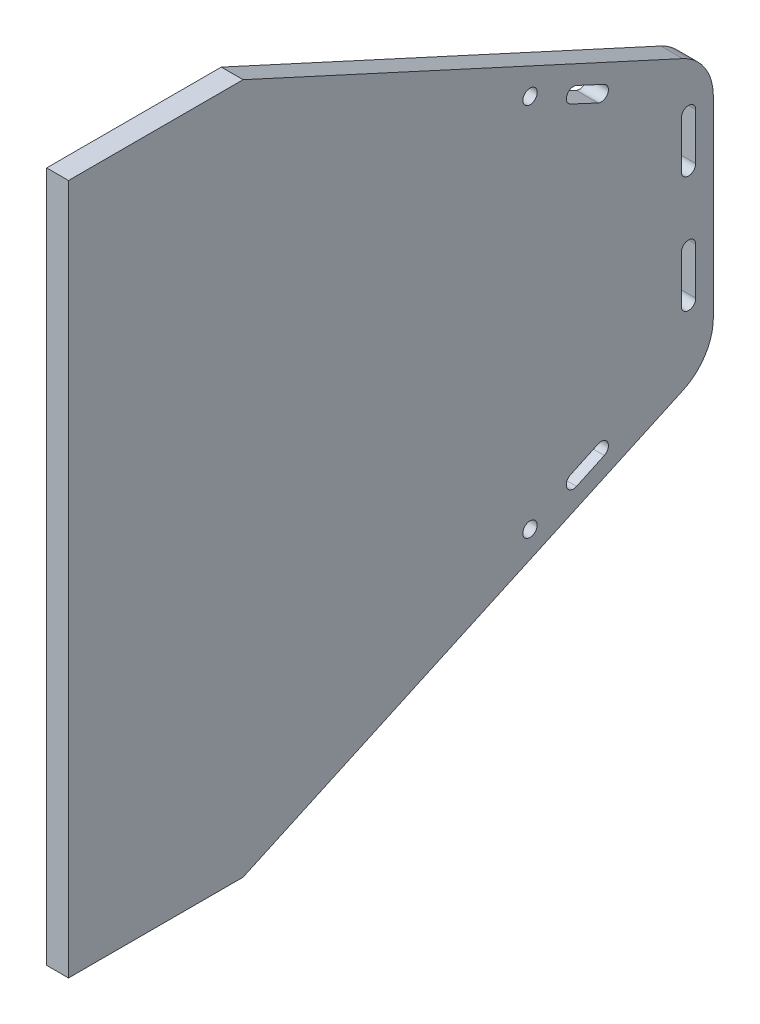
ISO-10303-21;
HEADER;
FILE_DESCRIPTION(('STEP AP214'),'2;1');
FILE_NAME('part.step','',(''),(''),'','','');
FILE_SCHEMA(('AUTOMOTIVE_DESIGN { 1 0 10303 214 1 1 1 1 }'));
ENDSEC;
DATA;
#1=APPLICATION_CONTEXT('core data for automotive mechanical design processes');
#2=APPLICATION_PROTOCOL_DEFINITION('international standard','automotive_design',2000,#1);
#3=PRODUCT_CONTEXT('',#1,'mechanical');
#4=PRODUCT('Part','Part','',(#3));
#5=PRODUCT_RELATED_PRODUCT_CATEGORY('part','',(#4));
#6=PRODUCT_DEFINITION_FORMATION('','',#4);
#7=PRODUCT_DEFINITION_CONTEXT('part definition',#1,'design');
#8=PRODUCT_DEFINITION('design','',#6,#7);
#9=PRODUCT_DEFINITION_SHAPE('','',#8);
#10=(LENGTH_UNIT() NAMED_UNIT(*) SI_UNIT(.MILLI.,.METRE.));
#11=(NAMED_UNIT(*) PLANE_ANGLE_UNIT() SI_UNIT($,.RADIAN.));
#12=(NAMED_UNIT(*) SI_UNIT($,.STERADIAN.) SOLID_ANGLE_UNIT());
#13=UNCERTAINTY_MEASURE_WITH_UNIT(LENGTH_MEASURE(1.E-05),#10,'distance_accuracy_value','');
#14=(GEOMETRIC_REPRESENTATION_CONTEXT(3) GLOBAL_UNCERTAINTY_ASSIGNED_CONTEXT((#13)) GLOBAL_UNIT_ASSIGNED_CONTEXT((#10,
#11,#12)) REPRESENTATION_CONTEXT('',''));
#15=CARTESIAN_POINT('',(0.,0.,0.));
#16=DIRECTION('',(0.,0.,1.));
#17=DIRECTION('',(1.,0.,0.));
#18=AXIS2_PLACEMENT_3D('',#15,#16,#17);
#19=CARTESIAN_POINT('',(5.,13.7554131280701,-91.6781823968794));
#20=DIRECTION('',(-1.,0.,0.));
#21=DIRECTION('',(0.,0.,1.));
#22=AXIS2_PLACEMENT_3D('',#19,#20,#21);
#23=CYLINDRICAL_SURFACE('',#22,12.);
#24=CARTESIAN_POINT('',(0.,13.7554131280701,-91.6781823968794));
#25=DIRECTION('',(1.,0.,0.));
#26=DIRECTION('',(0.,0.,-1.));
#27=AXIS2_PLACEMENT_3D('',#24,#25,#26);
#28=CIRCLE('',#27,12.);
#29=CARTESIAN_POINT('',(0.,2.84719137054536,-96.6792520913213));
#30=VERTEX_POINT('',#29);
#31=CARTESIAN_POINT('',(0.,13.7554131280701,-103.678182396879));
#32=VERTEX_POINT('',#31);
#33=EDGE_CURVE('E384',#30,#32,#28,.T.);
#34=ORIENTED_EDGE('',*,*,#33,.T.);
#35=DIRECTION('',(-1.,0.,0.));
#36=VECTOR('',#35,1.);
#37=CARTESIAN_POINT('',(5.,13.7554131280701,-103.678182396879));
#38=LINE('',#37,#36);
#39=CARTESIAN_POINT('',(5.,13.7554131280701,-103.678182396879));
#40=VERTEX_POINT('',#39);
#41=EDGE_CURVE('E11',#40,#32,#38,.T.);
#42=ORIENTED_EDGE('',*,*,#41,.F.);
#43=CARTESIAN_POINT('',(5.,13.7554131280701,-91.6781823968794));
#44=DIRECTION('',(1.,0.,0.));
#45=DIRECTION('',(0.,0.,-1.));
#46=AXIS2_PLACEMENT_3D('',#43,#44,#45);
#47=CIRCLE('',#46,12.);
#48=CARTESIAN_POINT('',(5.,2.84719137054536,-96.6792520913213));
#49=VERTEX_POINT('',#48);
#50=EDGE_CURVE('E394',#49,#40,#47,.T.);
#51=ORIENTED_EDGE('',*,*,#50,.F.);
#52=DIRECTION('',(-1.,0.,0.));
#53=VECTOR('',#52,1.);
#54=CARTESIAN_POINT('',(5.,2.84719137054536,-96.6792520913213));
#55=LINE('',#54,#53);
#56=EDGE_CURVE('E420',#49,#30,#55,.T.);
#57=ORIENTED_EDGE('',*,*,#56,.T.);
#58=EDGE_LOOP('',(#34,#42,#51,#57));
#59=FACE_BOUND('',#58,.T.);
#60=ADVANCED_FACE('F43',(#59),#23,.T.);
#61=CARTESIAN_POINT('',(5.,13.7554131280701,-103.678182396879));
#62=DIRECTION('',(0.,0.,1.));
#63=DIRECTION('',(1.,0.,0.));
#64=AXIS2_PLACEMENT_3D('',#61,#62,#63);
#65=PLANE('',#64);
#66=DIRECTION('',(0.,1.,0.));
#67=VECTOR('',#66,1.);
#68=CARTESIAN_POINT('',(0.,13.7554131280701,-103.678182396879));
#69=LINE('',#68,#67);
#70=CARTESIAN_POINT('',(0.,57.80541312807,-103.678182396879));
#71=VERTEX_POINT('',#70);
#72=EDGE_CURVE('E424',#32,#71,#69,.T.);
#73=ORIENTED_EDGE('',*,*,#72,.T.);
#74=DIRECTION('',(-1.,0.,0.));
#75=VECTOR('',#74,1.);
#76=CARTESIAN_POINT('',(5.,57.80541312807,-103.678182396879));
#77=LINE('',#76,#75);
#78=CARTESIAN_POINT('',(5.,57.80541312807,-103.678182396879));
#79=VERTEX_POINT('',#78);
#80=EDGE_CURVE('E51',#79,#71,#77,.T.);
#81=ORIENTED_EDGE('',*,*,#80,.F.);
#82=DIRECTION('',(0.,1.,0.));
#83=VECTOR('',#82,1.);
#84=CARTESIAN_POINT('',(5.,13.7554131280701,-103.678182396879));
#85=LINE('',#84,#83);
#86=EDGE_CURVE('E398',#40,#79,#85,.T.);
#87=ORIENTED_EDGE('',*,*,#86,.F.);
#88=ORIENTED_EDGE('',*,*,#41,.T.);
#89=EDGE_LOOP('',(#73,#81,#87,#88));
#90=FACE_BOUND('',#89,.T.);
#91=ADVANCED_FACE('F494',(#90),#65,.F.);
#92=CARTESIAN_POINT('',(5.,57.8054131280701,-91.6781823968794));
#93=DIRECTION('',(-1.,0.,0.));
#94=DIRECTION('',(0.,0.,1.));
#95=AXIS2_PLACEMENT_3D('',#92,#93,#94);
#96=CYLINDRICAL_SURFACE('',#95,12.);
#97=CARTESIAN_POINT('',(0.,57.8054131280701,-91.6781823968794));
#98=DIRECTION('',(1.,0.,0.));
#99=DIRECTION('',(0.,0.,-1.));
#100=AXIS2_PLACEMENT_3D('',#97,#98,#99);
#101=CIRCLE('',#100,12.);
#102=CARTESIAN_POINT('',(0.,68.7136348855948,-96.6792520913213));
#103=VERTEX_POINT('',#102);
#104=EDGE_CURVE('E427',#71,#103,#101,.T.);
#105=ORIENTED_EDGE('',*,*,#104,.T.);
#106=DIRECTION('',(-1.,0.,0.));
#107=VECTOR('',#106,1.);
#108=CARTESIAN_POINT('',(5.,68.7136348855948,-96.6792520913213));
#109=LINE('',#108,#107);
#110=CARTESIAN_POINT('',(5.,68.7136348855948,-96.6792520913213));
#111=VERTEX_POINT('',#110);
#112=EDGE_CURVE('E463',#111,#103,#109,.T.);
#113=ORIENTED_EDGE('',*,*,#112,.F.);
#114=CARTESIAN_POINT('',(5.,57.8054131280701,-91.6781823968794));
#115=DIRECTION('',(1.,0.,0.));
#116=DIRECTION('',(0.,0.,-1.));
#117=AXIS2_PLACEMENT_3D('',#114,#115,#116);
#118=CIRCLE('',#117,12.);
#119=EDGE_CURVE('E402',#79,#111,#118,.T.);
#120=ORIENTED_EDGE('',*,*,#119,.F.);
#121=ORIENTED_EDGE('',*,*,#80,.T.);
#122=EDGE_LOOP('',(#105,#113,#120,#121));
#123=FACE_BOUND('',#122,.T.);
#124=ADVANCED_FACE('F472',(#123),#96,.T.);
#125=CARTESIAN_POINT('',(5.,68.7136348855948,-96.6792520913213));
#126=DIRECTION('',(0.,-0.909018479793727,0.416755807870151));
#127=DIRECTION('',(0.,-0.416755807870151,-0.909018479793727));
#128=AXIS2_PLACEMENT_3D('',#125,#126,#127);
#129=PLANE('',#128);
#130=DIRECTION('',(0.,0.416755807870151,0.909018479793727));
#131=VECTOR('',#130,1.);
#132=CARTESIAN_POINT('',(0.,68.7136348855948,-96.6792520913213));
#133=LINE('',#132,#131);
#134=CARTESIAN_POINT('',(0.,114.89041312807,4.04050745867714));
#135=VERTEX_POINT('',#134);
#136=EDGE_CURVE('E430',#103,#135,#133,.T.);
#137=ORIENTED_EDGE('',*,*,#136,.T.);
#138=DIRECTION('',(-1.,0.,0.));
#139=VECTOR('',#138,1.);
#140=CARTESIAN_POINT('',(5.,114.89041312807,4.04050745867714));
#141=LINE('',#140,#139);
#142=CARTESIAN_POINT('',(5.,114.89041312807,4.04050745867714));
#143=VERTEX_POINT('',#142);
#144=EDGE_CURVE('E459',#143,#135,#141,.T.);
#145=ORIENTED_EDGE('',*,*,#144,.F.);
#146=DIRECTION('',(0.,0.416755807870151,0.909018479793727));
#147=VECTOR('',#146,1.);
#148=CARTESIAN_POINT('',(5.,68.7136348855948,-96.6792520913213));
#149=LINE('',#148,#147);
#150=EDGE_CURVE('E405',#111,#143,#149,.T.);
#151=ORIENTED_EDGE('',*,*,#150,.F.);
#152=ORIENTED_EDGE('',*,*,#112,.T.);
#153=EDGE_LOOP('',(#137,#145,#151,#152));
#154=FACE_BOUND('',#153,.T.);
#155=ADVANCED_FACE('F483',(#154),#129,.F.);
#156=CARTESIAN_POINT('',(5.,114.89041312807,4.04050745867714));
#157=DIRECTION('',(0.,-1.,0.));
#158=DIRECTION('',(0.,0.,-1.));
#159=AXIS2_PLACEMENT_3D('',#156,#157,#158);
#160=PLANE('',#159);
#161=DIRECTION('',(0.,0.,1.));
#162=VECTOR('',#161,1.);
#163=CARTESIAN_POINT('',(0.,114.89041312807,4.04050745867714));
#164=LINE('',#163,#162);
#165=CARTESIAN_POINT('',(0.,114.89041312807,44.0405074586771));
#166=VERTEX_POINT('',#165);
#167=EDGE_CURVE('E433',#135,#166,#164,.T.);
#168=ORIENTED_EDGE('',*,*,#167,.T.);
#169=DIRECTION('',(-1.,0.,0.));
#170=VECTOR('',#169,1.);
#171=CARTESIAN_POINT('',(5.,114.89041312807,44.0405074586771));
#172=LINE('',#171,#170);
#173=CARTESIAN_POINT('',(5.,114.89041312807,44.0405074586771));
#174=VERTEX_POINT('',#173);
#175=EDGE_CURVE('E455',#174,#166,#172,.T.);
#176=ORIENTED_EDGE('',*,*,#175,.F.);
#177=DIRECTION('',(0.,0.,1.));
#178=VECTOR('',#177,1.);
#179=CARTESIAN_POINT('',(5.,114.89041312807,4.04050745867714));
#180=LINE('',#179,#178);
#181=EDGE_CURVE('E408',#143,#174,#180,.T.);
#182=ORIENTED_EDGE('',*,*,#181,.F.);
#183=ORIENTED_EDGE('',*,*,#144,.T.);
#184=EDGE_LOOP('',(#168,#176,#182,#183));
#185=FACE_BOUND('',#184,.T.);
#186=ADVANCED_FACE('F487',(#185),#160,.F.);
#187=CARTESIAN_POINT('',(5.,114.89041312807,44.0405074586771));
#188=DIRECTION('',(0.,0.,-1.));
#189=DIRECTION('',(-1.,0.,0.));
#190=AXIS2_PLACEMENT_3D('',#187,#188,#189);
#191=PLANE('',#190);
#192=DIRECTION('',(0.,-1.,0.));
#193=VECTOR('',#192,1.);
#194=CARTESIAN_POINT('',(0.,114.89041312807,44.0405074586771));
#195=LINE('',#194,#193);
#196=CARTESIAN_POINT('',(0.,-43.3295868719299,44.0405074586771));
#197=VERTEX_POINT('',#196);
#198=EDGE_CURVE('E436',#166,#197,#195,.T.);
#199=ORIENTED_EDGE('',*,*,#198,.T.);
#200=DIRECTION('',(-1.,0.,0.));
#201=VECTOR('',#200,1.);
#202=CARTESIAN_POINT('',(5.,-43.3295868719299,44.0405074586771));
#203=LINE('',#202,#201);
#204=CARTESIAN_POINT('',(5.,-43.3295868719299,44.0405074586771));
#205=VERTEX_POINT('',#204);
#206=EDGE_CURVE('E451',#205,#197,#203,.T.);
#207=ORIENTED_EDGE('',*,*,#206,.F.);
#208=DIRECTION('',(0.,-1.,0.));
#209=VECTOR('',#208,1.);
#210=CARTESIAN_POINT('',(5.,114.89041312807,44.0405074586771));
#211=LINE('',#210,#209);
#212=EDGE_CURVE('E411',#174,#205,#211,.T.);
#213=ORIENTED_EDGE('',*,*,#212,.F.);
#214=ORIENTED_EDGE('',*,*,#175,.T.);
#215=EDGE_LOOP('',(#199,#207,#213,#214));
#216=FACE_BOUND('',#215,.T.);
#217=ADVANCED_FACE('F507',(#216),#191,.F.);
#218=CARTESIAN_POINT('',(5.,-43.3295868719299,44.0405074586771));
#219=DIRECTION('',(0.,1.,0.));
#220=DIRECTION('',(0.,0.,1.));
#221=AXIS2_PLACEMENT_3D('',#218,#219,#220);
#222=PLANE('',#221);
#223=DIRECTION('',(0.,0.,-1.));
#224=VECTOR('',#223,1.);
#225=CARTESIAN_POINT('',(0.,-43.3295868719299,44.0405074586771));
#226=LINE('',#225,#224);
#227=CARTESIAN_POINT('',(0.,-43.3295868719299,4.04050745867714));
#228=VERTEX_POINT('',#227);
#229=EDGE_CURVE('E439',#197,#228,#226,.T.);
#230=ORIENTED_EDGE('',*,*,#229,.T.);
#231=DIRECTION('',(-1.,0.,0.));
#232=VECTOR('',#231,1.);
#233=CARTESIAN_POINT('',(5.,-43.3295868719299,4.04050745867714));
#234=LINE('',#233,#232);
#235=CARTESIAN_POINT('',(5.,-43.3295868719299,4.04050745867714));
#236=VERTEX_POINT('',#235);
#237=EDGE_CURVE('E447',#236,#228,#234,.T.);
#238=ORIENTED_EDGE('',*,*,#237,.F.);
#239=DIRECTION('',(0.,0.,-1.));
#240=VECTOR('',#239,1.);
#241=CARTESIAN_POINT('',(5.,-43.3295868719299,44.0405074586771));
#242=LINE('',#241,#240);
#243=EDGE_CURVE('E414',#205,#236,#242,.T.);
#244=ORIENTED_EDGE('',*,*,#243,.F.);
#245=ORIENTED_EDGE('',*,*,#206,.T.);
#246=EDGE_LOOP('',(#230,#238,#244,#245));
#247=FACE_BOUND('',#246,.T.);
#248=ADVANCED_FACE('F505',(#247),#222,.F.);
#249=CARTESIAN_POINT('',(5.,-43.3295868719299,4.04050745867714));
#250=DIRECTION('',(0.,0.909018479793727,0.416755807870151));
#251=DIRECTION('',(0.,-0.416755807870151,0.909018479793727));
#252=AXIS2_PLACEMENT_3D('',#249,#250,#251);
#253=PLANE('',#252);
#254=DIRECTION('',(0.,0.416755807870151,-0.909018479793727));
#255=VECTOR('',#254,1.);
#256=CARTESIAN_POINT('',(0.,-43.3295868719299,4.04050745867714));
#257=LINE('',#256,#255);
#258=EDGE_CURVE('E399',#228,#30,#257,.T.);
#259=ORIENTED_EDGE('',*,*,#258,.T.);
#260=ORIENTED_EDGE('',*,*,#56,.F.);
#261=DIRECTION('',(0.,0.416755807870151,-0.909018479793727));
#262=VECTOR('',#261,1.);
#263=CARTESIAN_POINT('',(5.,-43.3295868719299,4.04050745867714));
#264=LINE('',#263,#262);
#265=EDGE_CURVE('E417',#236,#49,#264,.T.);
#266=ORIENTED_EDGE('',*,*,#265,.F.);
#267=ORIENTED_EDGE('',*,*,#237,.T.);
#268=EDGE_LOOP('',(#259,#260,#266,#267));
#269=FACE_BOUND('',#268,.T.);
#270=ADVANCED_FACE('F500',(#269),#253,.F.);
#271=CARTESIAN_POINT('',(5.,13.7554131280701,-91.6781823968794));
#272=DIRECTION('',(1.,0.,0.));
#273=DIRECTION('',(0.,0.,-1.));
#274=AXIS2_PLACEMENT_3D('',#271,#272,#273);
#275=PLANE('',#274);
#276=CARTESIAN_POINT('',(5.,78.7069164328306,-61.6849524923508));
#277=DIRECTION('',(1.,0.,0.));
#278=DIRECTION('',(0.,0.,1.));
#279=AXIS2_PLACEMENT_3D('',#276,#277,#278);
#280=CIRCLE('',#279,1.65);
#281=CARTESIAN_POINT('',(5.,78.7069164328306,-60.0349524923508));
#282=VERTEX_POINT('',#281);
#283=EDGE_CURVE('E267',#282,#282,#280,.T.);
#284=ORIENTED_EDGE('',*,*,#283,.F.);
#285=EDGE_LOOP('',(#284));
#286=FACE_BOUND('',#285,.T.);
#287=CARTESIAN_POINT('',(5.,30.4194880883811,-97.9970662353334));
#288=DIRECTION('',(1.,0.,0.));
#289=DIRECTION('',(0.,0.,-1.));
#290=AXIS2_PLACEMENT_3D('',#287,#288,#289);
#291=CIRCLE('',#290,1.65);
#292=CARTESIAN_POINT('',(5.,30.419488088381,-99.6470662353335));
#293=VERTEX_POINT('',#292);
#294=CARTESIAN_POINT('',(5.,30.419488088381,-96.3470662353335));
#295=VERTEX_POINT('',#294);
#296=EDGE_CURVE('E58',#293,#295,#291,.T.);
#297=ORIENTED_EDGE('',*,*,#296,.F.);
#298=DIRECTION('',(0.,1.,0.));
#299=VECTOR('',#298,1.);
#300=CARTESIAN_POINT('',(5.,30.419488088381,-99.6470662353335));
#301=LINE('',#300,#299);
#302=CARTESIAN_POINT('',(5.,19.719488088381,-99.6470662353335));
#303=VERTEX_POINT('',#302);
#304=EDGE_CURVE('E310',#303,#293,#301,.T.);
#305=ORIENTED_EDGE('',*,*,#304,.F.);
#306=CARTESIAN_POINT('',(5.,19.7194880883811,-97.9970662353334));
#307=DIRECTION('',(1.,0.,0.));
#308=DIRECTION('',(0.,0.,-1.));
#309=AXIS2_PLACEMENT_3D('',#306,#307,#308);
#310=CIRCLE('',#309,1.65);
#311=CARTESIAN_POINT('',(5.,19.719488088381,-96.3470662353334));
#312=VERTEX_POINT('',#311);
#313=EDGE_CURVE('E314',#312,#303,#310,.T.);
#314=ORIENTED_EDGE('',*,*,#313,.F.);
#315=DIRECTION('',(0.,-1.,0.));
#316=VECTOR('',#315,1.);
#317=CARTESIAN_POINT('',(5.,30.419488088381,-96.3470662353335));
#318=LINE('',#317,#316);
#319=EDGE_CURVE('E319',#295,#312,#318,.T.);
#320=ORIENTED_EDGE('',*,*,#319,.F.);
#321=EDGE_LOOP('',(#297,#305,#314,#320));
#322=FACE_BOUND('',#321,.T.);
#323=CARTESIAN_POINT('',(5.,-7.14609017669052,-61.6849524923508));
#324=DIRECTION('',(1.,0.,0.));
#325=DIRECTION('',(0.,0.,-1.));
#326=AXIS2_PLACEMENT_3D('',#323,#324,#325);
#327=CIRCLE('',#326,1.65);
#328=CARTESIAN_POINT('',(5.,-7.14609017669052,-63.3349524923508));
#329=VERTEX_POINT('',#328);
#330=EDGE_CURVE('E234',#329,#329,#327,.T.);
#331=ORIENTED_EDGE('',*,*,#330,.F.);
#332=EDGE_LOOP('',(#331));
#333=FACE_BOUND('',#332,.T.);
#334=CARTESIAN_POINT('',(5.,74.0559042900099,-71.6533067219784));
#335=DIRECTION('',(1.,0.,0.));
#336=DIRECTION('',(0.,0.,1.));
#337=AXIS2_PLACEMENT_3D('',#334,#335,#336);
#338=CIRCLE('',#337,1.64999999999999);
#339=CARTESIAN_POINT('',(5.,75.551157424454,-72.3509585434015));
#340=VERTEX_POINT('',#339);
#341=CARTESIAN_POINT('',(5.,72.5606511555658,-70.9556549005552));
#342=VERTEX_POINT('',#341);
#343=EDGE_CURVE('E66',#340,#342,#338,.T.);
#344=ORIENTED_EDGE('',*,*,#343,.F.);
#345=DIRECTION('',(0.,0.422819285710973,0.906214020875236));
#346=VECTOR('',#345,1.);
#347=CARTESIAN_POINT('',(5.,75.551157424454,-72.3509585434015));
#348=LINE('',#347,#346);
#349=CARTESIAN_POINT('',(5.,72.5914224244772,-78.6944566895281));
#350=VERTEX_POINT('',#349);
#351=EDGE_CURVE('E215',#350,#340,#348,.T.);
#352=ORIENTED_EDGE('',*,*,#351,.F.);
#353=CARTESIAN_POINT('',(5.,71.0961692900331,-77.996804868105));
#354=DIRECTION('',(1.,0.,0.));
#355=DIRECTION('',(0.,0.,1.));
#356=AXIS2_PLACEMENT_3D('',#353,#354,#355);
#357=CIRCLE('',#356,1.65);
#358=CARTESIAN_POINT('',(5.,69.600916155589,-77.2991530466819));
#359=VERTEX_POINT('',#358);
#360=EDGE_CURVE('E221',#359,#350,#357,.T.);
#361=ORIENTED_EDGE('',*,*,#360,.F.);
#362=DIRECTION('',(0.,-0.422819285710975,-0.906214020875235));
#363=VECTOR('',#362,1.);
#364=CARTESIAN_POINT('',(5.,72.5606511555658,-70.9556549005552));
#365=LINE('',#364,#363);
#366=EDGE_CURVE('E227',#342,#359,#365,.T.);
#367=ORIENTED_EDGE('',*,*,#366,.F.);
#368=EDGE_LOOP('',(#344,#352,#361,#367));
#369=FACE_BOUND('',#368,.T.);
#370=CARTESIAN_POINT('',(5.,-2.49507803386982,-71.6533067219784));
#371=DIRECTION('',(1.,0.,0.));
#372=DIRECTION('',(0.,0.,-1.));
#373=AXIS2_PLACEMENT_3D('',#370,#371,#372);
#374=CIRCLE('',#373,1.65);
#375=CARTESIAN_POINT('',(5.,-0.999824899425717,-70.9556549005552));
#376=VERTEX_POINT('',#375);
#377=CARTESIAN_POINT('',(5.,-3.99033116831398,-72.3509585434015));
#378=VERTEX_POINT('',#377);
#379=EDGE_CURVE('E212',#376,#378,#374,.T.);
#380=ORIENTED_EDGE('',*,*,#379,.F.);
#381=DIRECTION('',(0.,-0.422819285710974,0.906214020875235));
#382=VECTOR('',#381,1.);
#383=CARTESIAN_POINT('',(5.,-0.999824899425717,-70.9556549005552));
#384=LINE('',#383,#382);
#385=CARTESIAN_POINT('',(5.,1.95991010055112,-77.2991530466819));
#386=VERTEX_POINT('',#385);
#387=EDGE_CURVE('E268',#386,#376,#384,.T.);
#388=ORIENTED_EDGE('',*,*,#387,.F.);
#389=CARTESIAN_POINT('',(5.,0.46465696610698,-77.996804868105));
#390=DIRECTION('',(1.,0.,0.));
#391=DIRECTION('',(0.,0.,-1.));
#392=AXIS2_PLACEMENT_3D('',#389,#390,#391);
#393=CIRCLE('',#392,1.65);
#394=CARTESIAN_POINT('',(5.,-1.03059616833715,-78.6944566895281));
#395=VERTEX_POINT('',#394);
#396=EDGE_CURVE('E272',#395,#386,#393,.T.);
#397=ORIENTED_EDGE('',*,*,#396,.F.);
#398=DIRECTION('',(0.,0.422819285710973,-0.906214020875236));
#399=VECTOR('',#398,1.);
#400=CARTESIAN_POINT('',(5.,-3.99033116831397,-72.3509585434015));
#401=LINE('',#400,#399);
#402=EDGE_CURVE('E277',#378,#395,#401,.T.);
#403=ORIENTED_EDGE('',*,*,#402,.F.);
#404=EDGE_LOOP('',(#380,#388,#397,#403));
#405=FACE_BOUND('',#404,.T.);
#406=CARTESIAN_POINT('',(5.,57.1194880883811,-97.9970662353334));
#407=DIRECTION('',(1.,0.,0.));
#408=DIRECTION('',(0.,0.,-1.));
#409=AXIS2_PLACEMENT_3D('',#406,#407,#408);
#410=CIRCLE('',#409,1.65000000000003);
#411=CARTESIAN_POINT('',(5.,57.119488088381,-99.6470662353335));
#412=VERTEX_POINT('',#411);
#413=CARTESIAN_POINT('',(5.,57.119488088381,-96.3470662353335));
#414=VERTEX_POINT('',#413);
#415=EDGE_CURVE('E325',#412,#414,#410,.T.);
#416=ORIENTED_EDGE('',*,*,#415,.F.);
#417=DIRECTION('',(0.,1.,0.));
#418=VECTOR('',#417,1.);
#419=CARTESIAN_POINT('',(5.,57.119488088381,-99.6470662353335));
#420=LINE('',#419,#418);
#421=CARTESIAN_POINT('',(5.,46.419488088381,-99.6470662353335));
#422=VERTEX_POINT('',#421);
#423=EDGE_CURVE('E355',#422,#412,#420,.T.);
#424=ORIENTED_EDGE('',*,*,#423,.F.);
#425=CARTESIAN_POINT('',(5.,46.4194880883811,-97.9970662353334));
#426=DIRECTION('',(1.,0.,0.));
#427=DIRECTION('',(0.,0.,-1.));
#428=AXIS2_PLACEMENT_3D('',#425,#426,#427);
#429=CIRCLE('',#428,1.65000000000001);
#430=CARTESIAN_POINT('',(5.,46.419488088381,-96.3470662353334));
#431=VERTEX_POINT('',#430);
#432=EDGE_CURVE('E374',#431,#422,#429,.T.);
#433=ORIENTED_EDGE('',*,*,#432,.F.);
#434=DIRECTION('',(0.,-1.,0.));
#435=VECTOR('',#434,1.);
#436=CARTESIAN_POINT('',(5.,57.119488088381,-96.3470662353335));
#437=LINE('',#436,#435);
#438=EDGE_CURVE('E370',#414,#431,#437,.T.);
#439=ORIENTED_EDGE('',*,*,#438,.F.);
#440=EDGE_LOOP('',(#416,#424,#433,#439));
#441=FACE_BOUND('',#440,.T.);
#442=ORIENTED_EDGE('',*,*,#50,.T.);
#443=ORIENTED_EDGE('',*,*,#86,.T.);
#444=ORIENTED_EDGE('',*,*,#119,.T.);
#445=ORIENTED_EDGE('',*,*,#150,.T.);
#446=ORIENTED_EDGE('',*,*,#181,.T.);
#447=ORIENTED_EDGE('',*,*,#212,.T.);
#448=ORIENTED_EDGE('',*,*,#243,.T.);
#449=ORIENTED_EDGE('',*,*,#265,.T.);
#450=EDGE_LOOP('',(#442,#443,#444,#445,#446,#447,#448,#449));
#451=FACE_BOUND('',#450,.T.);
#452=ADVANCED_FACE('F224',(#286,#322,#333,#369,#405,#441,#451),#275,.T.);
#453=CARTESIAN_POINT('',(0.,13.7554131280701,-91.6781823968794));
#454=DIRECTION('',(1.,0.,0.));
#455=DIRECTION('',(0.,0.,-1.));
#456=AXIS2_PLACEMENT_3D('',#453,#454,#455);
#457=PLANE('',#456);
#458=CARTESIAN_POINT('',(0.,78.7069164328306,-61.6849524923508));
#459=DIRECTION('',(1.,0.,0.));
#460=DIRECTION('',(0.,0.,1.));
#461=AXIS2_PLACEMENT_3D('',#458,#459,#460);
#462=CIRCLE('',#461,1.65);
#463=CARTESIAN_POINT('',(0.,78.7069164328306,-60.0349524923508));
#464=VERTEX_POINT('',#463);
#465=EDGE_CURVE('E346',#464,#464,#462,.T.);
#466=ORIENTED_EDGE('',*,*,#465,.T.);
#467=EDGE_LOOP('',(#466));
#468=FACE_BOUND('',#467,.T.);
#469=DIRECTION('',(0.,1.,0.));
#470=VECTOR('',#469,1.);
#471=CARTESIAN_POINT('',(0.,30.419488088381,-99.6470662353335));
#472=LINE('',#471,#470);
#473=CARTESIAN_POINT('',(0.,19.719488088381,-99.6470662353335));
#474=VERTEX_POINT('',#473);
#475=CARTESIAN_POINT('',(0.,30.419488088381,-99.6470662353335));
#476=VERTEX_POINT('',#475);
#477=EDGE_CURVE('E300',#474,#476,#472,.T.);
#478=ORIENTED_EDGE('',*,*,#477,.T.);
#479=CARTESIAN_POINT('',(0.,30.4194880883811,-97.9970662353334));
#480=DIRECTION('',(1.,0.,0.));
#481=DIRECTION('',(0.,0.,-1.));
#482=AXIS2_PLACEMENT_3D('',#479,#480,#481);
#483=CIRCLE('',#482,1.65);
#484=CARTESIAN_POINT('',(0.,30.419488088381,-96.3470662353335));
#485=VERTEX_POINT('',#484);
#486=EDGE_CURVE('E315',#476,#485,#483,.T.);
#487=ORIENTED_EDGE('',*,*,#486,.T.);
#488=DIRECTION('',(0.,-1.,0.));
#489=VECTOR('',#488,1.);
#490=CARTESIAN_POINT('',(0.,30.419488088381,-96.3470662353335));
#491=LINE('',#490,#489);
#492=CARTESIAN_POINT('',(0.,19.719488088381,-96.3470662353335));
#493=VERTEX_POINT('',#492);
#494=EDGE_CURVE('E333',#485,#493,#491,.T.);
#495=ORIENTED_EDGE('',*,*,#494,.T.);
#496=CARTESIAN_POINT('',(0.,19.7194880883811,-97.9970662353334));
#497=DIRECTION('',(1.,0.,0.));
#498=DIRECTION('',(0.,0.,-1.));
#499=AXIS2_PLACEMENT_3D('',#496,#497,#498);
#500=CIRCLE('',#499,1.65);
#501=EDGE_CURVE('E329',#493,#474,#500,.T.);
#502=ORIENTED_EDGE('',*,*,#501,.T.);
#503=EDGE_LOOP('',(#478,#487,#495,#502));
#504=FACE_BOUND('',#503,.T.);
#505=CARTESIAN_POINT('',(0.,-7.14609017669052,-61.6849524923508));
#506=DIRECTION('',(1.,0.,0.));
#507=DIRECTION('',(0.,0.,-1.));
#508=AXIS2_PLACEMENT_3D('',#505,#506,#507);
#509=CIRCLE('',#508,1.65);
#510=CARTESIAN_POINT('',(0.,-7.14609017669052,-63.3349524923508));
#511=VERTEX_POINT('',#510);
#512=EDGE_CURVE('E229',#511,#511,#509,.T.);
#513=ORIENTED_EDGE('',*,*,#512,.T.);
#514=EDGE_LOOP('',(#513));
#515=FACE_BOUND('',#514,.T.);
#516=DIRECTION('',(0.,0.422819285710973,0.906214020875236));
#517=VECTOR('',#516,1.);
#518=CARTESIAN_POINT('',(0.,75.551157424454,-72.3509585434015));
#519=LINE('',#518,#517);
#520=CARTESIAN_POINT('',(0.,72.5914224244772,-78.6944566895281));
#521=VERTEX_POINT('',#520);
#522=CARTESIAN_POINT('',(0.,75.551157424454,-72.3509585434015));
#523=VERTEX_POINT('',#522);
#524=EDGE_CURVE('E239',#521,#523,#519,.T.);
#525=ORIENTED_EDGE('',*,*,#524,.T.);
#526=CARTESIAN_POINT('',(0.,74.0559042900099,-71.6533067219784));
#527=DIRECTION('',(1.,0.,0.));
#528=DIRECTION('',(0.,0.,1.));
#529=AXIS2_PLACEMENT_3D('',#526,#527,#528);
#530=CIRCLE('',#529,1.64999999999999);
#531=CARTESIAN_POINT('',(0.,72.5606511555658,-70.9556549005552));
#532=VERTEX_POINT('',#531);
#533=EDGE_CURVE('E206',#523,#532,#530,.T.);
#534=ORIENTED_EDGE('',*,*,#533,.T.);
#535=DIRECTION('',(0.,-0.422819285710975,-0.906214020875235));
#536=VECTOR('',#535,1.);
#537=CARTESIAN_POINT('',(0.,72.5606511555658,-70.9556549005552));
#538=LINE('',#537,#536);
#539=CARTESIAN_POINT('',(0.,69.600916155589,-77.2991530466819));
#540=VERTEX_POINT('',#539);
#541=EDGE_CURVE('E247',#532,#540,#538,.T.);
#542=ORIENTED_EDGE('',*,*,#541,.T.);
#543=CARTESIAN_POINT('',(0.,71.0961692900331,-77.996804868105));
#544=DIRECTION('',(1.,0.,0.));
#545=DIRECTION('',(0.,0.,1.));
#546=AXIS2_PLACEMENT_3D('',#543,#544,#545);
#547=CIRCLE('',#546,1.65);
#548=EDGE_CURVE('E242',#540,#521,#547,.T.);
#549=ORIENTED_EDGE('',*,*,#548,.T.);
#550=EDGE_LOOP('',(#525,#534,#542,#549));
#551=FACE_BOUND('',#550,.T.);
#552=DIRECTION('',(0.,-0.422819285710974,0.906214020875235));
#553=VECTOR('',#552,1.);
#554=CARTESIAN_POINT('',(0.,-0.999824899425717,-70.9556549005552));
#555=LINE('',#554,#553);
#556=CARTESIAN_POINT('',(0.,1.95991010055112,-77.2991530466819));
#557=VERTEX_POINT('',#556);
#558=CARTESIAN_POINT('',(0.,-0.999824899425717,-70.9556549005552));
#559=VERTEX_POINT('',#558);
#560=EDGE_CURVE('E257',#557,#559,#555,.T.);
#561=ORIENTED_EDGE('',*,*,#560,.T.);
#562=CARTESIAN_POINT('',(0.,-2.49507803386982,-71.6533067219784));
#563=DIRECTION('',(1.,0.,0.));
#564=DIRECTION('',(0.,0.,-1.));
#565=AXIS2_PLACEMENT_3D('',#562,#563,#564);
#566=CIRCLE('',#565,1.65);
#567=CARTESIAN_POINT('',(0.,-3.99033116831397,-72.3509585434015));
#568=VERTEX_POINT('',#567);
#569=EDGE_CURVE('E273',#559,#568,#566,.T.);
#570=ORIENTED_EDGE('',*,*,#569,.T.);
#571=DIRECTION('',(0.,0.422819285710973,-0.906214020875236));
#572=VECTOR('',#571,1.);
#573=CARTESIAN_POINT('',(0.,-3.99033116831397,-72.3509585434015));
#574=LINE('',#573,#572);
#575=CARTESIAN_POINT('',(0.,-1.03059616833716,-78.6944566895281));
#576=VERTEX_POINT('',#575);
#577=EDGE_CURVE('E290',#568,#576,#574,.T.);
#578=ORIENTED_EDGE('',*,*,#577,.T.);
#579=CARTESIAN_POINT('',(0.,0.46465696610698,-77.996804868105));
#580=DIRECTION('',(1.,0.,0.));
#581=DIRECTION('',(0.,0.,-1.));
#582=AXIS2_PLACEMENT_3D('',#579,#580,#581);
#583=CIRCLE('',#582,1.65);
#584=EDGE_CURVE('E286',#576,#557,#583,.T.);
#585=ORIENTED_EDGE('',*,*,#584,.T.);
#586=EDGE_LOOP('',(#561,#570,#578,#585));
#587=FACE_BOUND('',#586,.T.);
#588=DIRECTION('',(0.,1.,0.));
#589=VECTOR('',#588,1.);
#590=CARTESIAN_POINT('',(0.,57.119488088381,-99.6470662353335));
#591=LINE('',#590,#589);
#592=CARTESIAN_POINT('',(0.,46.419488088381,-99.6470662353335));
#593=VERTEX_POINT('',#592);
#594=CARTESIAN_POINT('',(0.,57.119488088381,-99.6470662353335));
#595=VERTEX_POINT('',#594);
#596=EDGE_CURVE('E363',#593,#595,#591,.T.);
#597=ORIENTED_EDGE('',*,*,#596,.T.);
#598=CARTESIAN_POINT('',(0.,57.1194880883811,-97.9970662353334));
#599=DIRECTION('',(1.,0.,0.));
#600=DIRECTION('',(0.,0.,-1.));
#601=AXIS2_PLACEMENT_3D('',#598,#599,#600);
#602=CIRCLE('',#601,1.65000000000003);
#603=CARTESIAN_POINT('',(0.,57.119488088381,-96.3470662353335));
#604=VERTEX_POINT('',#603);
#605=EDGE_CURVE('E350',#595,#604,#602,.T.);
#606=ORIENTED_EDGE('',*,*,#605,.T.);
#607=DIRECTION('',(0.,-1.,0.));
#608=VECTOR('',#607,1.);
#609=CARTESIAN_POINT('',(0.,57.119488088381,-96.3470662353335));
#610=LINE('',#609,#608);
#611=CARTESIAN_POINT('',(0.,46.419488088381,-96.3470662353335));
#612=VERTEX_POINT('',#611);
#613=EDGE_CURVE('E354',#604,#612,#610,.T.);
#614=ORIENTED_EDGE('',*,*,#613,.T.);
#615=CARTESIAN_POINT('',(0.,46.4194880883811,-97.9970662353334));
#616=DIRECTION('',(1.,0.,0.));
#617=DIRECTION('',(0.,0.,-1.));
#618=AXIS2_PLACEMENT_3D('',#615,#616,#617);
#619=CIRCLE('',#618,1.65000000000001);
#620=EDGE_CURVE('E359',#612,#593,#619,.T.);
#621=ORIENTED_EDGE('',*,*,#620,.T.);
#622=EDGE_LOOP('',(#597,#606,#614,#621));
#623=FACE_BOUND('',#622,.T.);
#624=ORIENTED_EDGE('',*,*,#33,.F.);
#625=ORIENTED_EDGE('',*,*,#258,.F.);
#626=ORIENTED_EDGE('',*,*,#229,.F.);
#627=ORIENTED_EDGE('',*,*,#198,.F.);
#628=ORIENTED_EDGE('',*,*,#167,.F.);
#629=ORIENTED_EDGE('',*,*,#136,.F.);
#630=ORIENTED_EDGE('',*,*,#104,.F.);
#631=ORIENTED_EDGE('',*,*,#72,.F.);
#632=EDGE_LOOP('',(#624,#625,#626,#627,#628,#629,#630,#631));
#633=FACE_BOUND('',#632,.T.);
#634=ADVANCED_FACE('F478',(#468,#504,#515,#551,#587,#623,#633),#457,.F.);
#635=CARTESIAN_POINT('',(0.,57.1194880883811,-97.9970662353334));
#636=DIRECTION('',(1.,0.,0.));
#637=DIRECTION('',(0.,0.,-1.));
#638=AXIS2_PLACEMENT_3D('',#635,#636,#637);
#639=CYLINDRICAL_SURFACE('',#638,1.65000000000003);
#640=ORIENTED_EDGE('',*,*,#415,.T.);
#641=DIRECTION('',(1.,0.,0.));
#642=VECTOR('',#641,1.);
#643=CARTESIAN_POINT('',(0.,57.119488088381,-96.3470662353335));
#644=LINE('',#643,#642);
#645=EDGE_CURVE('E367',#604,#414,#644,.T.);
#646=ORIENTED_EDGE('',*,*,#645,.F.);
#647=ORIENTED_EDGE('',*,*,#605,.F.);
#648=DIRECTION('',(1.,0.,0.));
#649=VECTOR('',#648,1.);
#650=CARTESIAN_POINT('',(0.,57.119488088381,-99.6470662353335));
#651=LINE('',#650,#649);
#652=EDGE_CURVE('E381',#595,#412,#651,.T.);
#653=ORIENTED_EDGE('',*,*,#652,.T.);
#654=EDGE_LOOP('',(#640,#646,#647,#653));
#655=FACE_BOUND('',#654,.T.);
#656=ADVANCED_FACE('F575',(#655),#639,.F.);
#657=CARTESIAN_POINT('',(0.,57.119488088381,-99.6470662353335));
#658=DIRECTION('',(0.,0.,-1.));
#659=DIRECTION('',(0.,1.,0.));
#660=AXIS2_PLACEMENT_3D('',#657,#658,#659);
#661=PLANE('',#660);
#662=ORIENTED_EDGE('',*,*,#423,.T.);
#663=ORIENTED_EDGE('',*,*,#652,.F.);
#664=ORIENTED_EDGE('',*,*,#596,.F.);
#665=DIRECTION('',(1.,0.,0.));
#666=VECTOR('',#665,1.);
#667=CARTESIAN_POINT('',(0.,46.419488088381,-99.6470662353335));
#668=LINE('',#667,#666);
#669=EDGE_CURVE('E385',#593,#422,#668,.T.);
#670=ORIENTED_EDGE('',*,*,#669,.T.);
#671=EDGE_LOOP('',(#662,#663,#664,#670));
#672=FACE_BOUND('',#671,.T.);
#673=ADVANCED_FACE('F586',(#672),#661,.F.);
#674=CARTESIAN_POINT('',(0.,46.4194880883811,-97.9970662353334));
#675=DIRECTION('',(1.,0.,0.));
#676=DIRECTION('',(0.,0.,-1.));
#677=AXIS2_PLACEMENT_3D('',#674,#675,#676);
#678=CYLINDRICAL_SURFACE('',#677,1.65000000000001);
#679=ORIENTED_EDGE('',*,*,#432,.T.);
#680=ORIENTED_EDGE('',*,*,#669,.F.);
#681=ORIENTED_EDGE('',*,*,#620,.F.);
#682=DIRECTION('',(1.,0.,0.));
#683=VECTOR('',#682,1.);
#684=CARTESIAN_POINT('',(0.,46.419488088381,-96.3470662353334));
#685=LINE('',#684,#683);
#686=EDGE_CURVE('E388',#612,#431,#685,.T.);
#687=ORIENTED_EDGE('',*,*,#686,.T.);
#688=EDGE_LOOP('',(#679,#680,#681,#687));
#689=FACE_BOUND('',#688,.T.);
#690=ADVANCED_FACE('F597',(#689),#678,.F.);
#691=CARTESIAN_POINT('',(0.,57.119488088381,-96.3470662353335));
#692=DIRECTION('',(0.,0.,1.));
#693=DIRECTION('',(0.,-1.,0.));
#694=AXIS2_PLACEMENT_3D('',#691,#692,#693);
#695=PLANE('',#694);
#696=ORIENTED_EDGE('',*,*,#438,.T.);
#697=ORIENTED_EDGE('',*,*,#686,.F.);
#698=ORIENTED_EDGE('',*,*,#613,.F.);
#699=ORIENTED_EDGE('',*,*,#645,.T.);
#700=EDGE_LOOP('',(#696,#697,#698,#699));
#701=FACE_BOUND('',#700,.T.);
#702=ADVANCED_FACE('F608',(#701),#695,.F.);
#703=CARTESIAN_POINT('',(0.,-2.49507803386982,-71.6533067219784));
#704=DIRECTION('',(1.,0.,0.));
#705=DIRECTION('',(0.,0.,-1.));
#706=AXIS2_PLACEMENT_3D('',#703,#704,#705);
#707=CYLINDRICAL_SURFACE('',#706,1.65);
#708=ORIENTED_EDGE('',*,*,#379,.T.);
#709=DIRECTION('',(1.,0.,0.));
#710=VECTOR('',#709,1.);
#711=CARTESIAN_POINT('',(0.,-3.99033116831397,-72.3509585434015));
#712=LINE('',#711,#710);
#713=EDGE_CURVE('E253',#568,#378,#712,.T.);
#714=ORIENTED_EDGE('',*,*,#713,.F.);
#715=ORIENTED_EDGE('',*,*,#569,.F.);
#716=DIRECTION('',(1.,0.,0.));
#717=VECTOR('',#716,1.);
#718=CARTESIAN_POINT('',(0.,-0.999824899425717,-70.9556549005552));
#719=LINE('',#718,#717);
#720=EDGE_CURVE('E264',#559,#376,#719,.T.);
#721=ORIENTED_EDGE('',*,*,#720,.T.);
#722=EDGE_LOOP('',(#708,#714,#715,#721));
#723=FACE_BOUND('',#722,.T.);
#724=ADVANCED_FACE('F619',(#723),#707,.F.);
#725=CARTESIAN_POINT('',(0.,-0.999824899425717,-70.9556549005552));
#726=DIRECTION('',(0.,0.906214020875235,0.422819285710974));
#727=DIRECTION('',(0.,-0.422819285710974,0.906214020875236));
#728=AXIS2_PLACEMENT_3D('',#725,#726,#727);
#729=PLANE('',#728);
#730=ORIENTED_EDGE('',*,*,#387,.T.);
#731=ORIENTED_EDGE('',*,*,#720,.F.);
#732=ORIENTED_EDGE('',*,*,#560,.F.);
#733=DIRECTION('',(1.,0.,0.));
#734=VECTOR('',#733,1.);
#735=CARTESIAN_POINT('',(0.,1.95991010055112,-77.2991530466819));
#736=LINE('',#735,#734);
#737=EDGE_CURVE('E261',#557,#386,#736,.T.);
#738=ORIENTED_EDGE('',*,*,#737,.T.);
#739=EDGE_LOOP('',(#730,#731,#732,#738));
#740=FACE_BOUND('',#739,.T.);
#741=ADVANCED_FACE('F630',(#740),#729,.F.);
#742=CARTESIAN_POINT('',(0.,0.46465696610698,-77.996804868105));
#743=DIRECTION('',(1.,0.,0.));
#744=DIRECTION('',(0.,0.,-1.));
#745=AXIS2_PLACEMENT_3D('',#742,#743,#744);
#746=CYLINDRICAL_SURFACE('',#745,1.65);
#747=ORIENTED_EDGE('',*,*,#396,.T.);
#748=ORIENTED_EDGE('',*,*,#737,.F.);
#749=ORIENTED_EDGE('',*,*,#584,.F.);
#750=DIRECTION('',(1.,0.,0.));
#751=VECTOR('',#750,1.);
#752=CARTESIAN_POINT('',(0.,-1.03059616833715,-78.6944566895281));
#753=LINE('',#752,#751);
#754=EDGE_CURVE('E258',#576,#395,#753,.T.);
#755=ORIENTED_EDGE('',*,*,#754,.T.);
#756=EDGE_LOOP('',(#747,#748,#749,#755));
#757=FACE_BOUND('',#756,.T.);
#758=ADVANCED_FACE('F641',(#757),#746,.F.);
#759=CARTESIAN_POINT('',(0.,-3.99033116831397,-72.3509585434015));
#760=DIRECTION('',(0.,-0.906214020875236,-0.422819285710973));
#761=DIRECTION('',(0.,0.422819285710973,-0.906214020875236));
#762=AXIS2_PLACEMENT_3D('',#759,#760,#761);
#763=PLANE('',#762);
#764=ORIENTED_EDGE('',*,*,#402,.T.);
#765=ORIENTED_EDGE('',*,*,#754,.F.);
#766=ORIENTED_EDGE('',*,*,#577,.F.);
#767=ORIENTED_EDGE('',*,*,#713,.T.);
#768=EDGE_LOOP('',(#764,#765,#766,#767));
#769=FACE_BOUND('',#768,.T.);
#770=ADVANCED_FACE('F652',(#769),#763,.F.);
#771=CARTESIAN_POINT('',(0.,74.0559042900099,-71.6533067219784));
#772=DIRECTION('',(1.,0.,0.));
#773=DIRECTION('',(0.,0.,-1.));
#774=AXIS2_PLACEMENT_3D('',#771,#772,#773);
#775=CYLINDRICAL_SURFACE('',#774,1.64999999999999);
#776=ORIENTED_EDGE('',*,*,#343,.T.);
#777=DIRECTION('',(1.,0.,0.));
#778=VECTOR('',#777,1.);
#779=CARTESIAN_POINT('',(0.,72.5606511555658,-70.9556549005552));
#780=LINE('',#779,#778);
#781=EDGE_CURVE('E243',#532,#342,#780,.T.);
#782=ORIENTED_EDGE('',*,*,#781,.F.);
#783=ORIENTED_EDGE('',*,*,#533,.F.);
#784=DIRECTION('',(1.,0.,0.));
#785=VECTOR('',#784,1.);
#786=CARTESIAN_POINT('',(0.,75.551157424454,-72.3509585434015));
#787=LINE('',#786,#785);
#788=EDGE_CURVE('E202',#523,#340,#787,.T.);
#789=ORIENTED_EDGE('',*,*,#788,.T.);
#790=EDGE_LOOP('',(#776,#782,#783,#789));
#791=FACE_BOUND('',#790,.T.);
#792=ADVANCED_FACE('F204',(#791),#775,.F.);
#793=CARTESIAN_POINT('',(0.,75.551157424454,-72.3509585434015));
#794=DIRECTION('',(0.,0.906214020875236,-0.422819285710973));
#795=DIRECTION('',(0.,0.422819285710973,0.906214020875236));
#796=AXIS2_PLACEMENT_3D('',#793,#794,#795);
#797=PLANE('',#796);
#798=ORIENTED_EDGE('',*,*,#351,.T.);
#799=ORIENTED_EDGE('',*,*,#788,.F.);
#800=ORIENTED_EDGE('',*,*,#524,.F.);
#801=DIRECTION('',(1.,0.,0.));
#802=VECTOR('',#801,1.);
#803=CARTESIAN_POINT('',(0.,72.5914224244772,-78.6944566895281));
#804=LINE('',#803,#802);
#805=EDGE_CURVE('E211',#521,#350,#804,.T.);
#806=ORIENTED_EDGE('',*,*,#805,.T.);
#807=EDGE_LOOP('',(#798,#799,#800,#806));
#808=FACE_BOUND('',#807,.T.);
#809=ADVANCED_FACE('F216',(#808),#797,.F.);
#810=CARTESIAN_POINT('',(0.,71.0961692900331,-77.996804868105));
#811=DIRECTION('',(1.,0.,0.));
#812=DIRECTION('',(0.,0.,-1.));
#813=AXIS2_PLACEMENT_3D('',#810,#811,#812);
#814=CYLINDRICAL_SURFACE('',#813,1.65);
#815=ORIENTED_EDGE('',*,*,#360,.T.);
#816=ORIENTED_EDGE('',*,*,#805,.F.);
#817=ORIENTED_EDGE('',*,*,#548,.F.);
#818=DIRECTION('',(1.,0.,0.));
#819=VECTOR('',#818,1.);
#820=CARTESIAN_POINT('',(0.,69.600916155589,-77.2991530466819));
#821=LINE('',#820,#819);
#822=EDGE_CURVE('E858',#540,#359,#821,.T.);
#823=ORIENTED_EDGE('',*,*,#822,.T.);
#824=EDGE_LOOP('',(#815,#816,#817,#823));
#825=FACE_BOUND('',#824,.T.);
#826=ADVANCED_FACE('F682',(#825),#814,.F.);
#827=CARTESIAN_POINT('',(0.,72.5606511555658,-70.9556549005552));
#828=DIRECTION('',(0.,-0.906214020875235,0.422819285710975));
#829=DIRECTION('',(0.,-0.422819285710975,-0.906214020875235));
#830=AXIS2_PLACEMENT_3D('',#827,#828,#829);
#831=PLANE('',#830);
#832=ORIENTED_EDGE('',*,*,#366,.T.);
#833=ORIENTED_EDGE('',*,*,#822,.F.);
#834=ORIENTED_EDGE('',*,*,#541,.F.);
#835=ORIENTED_EDGE('',*,*,#781,.T.);
#836=EDGE_LOOP('',(#832,#833,#834,#835));
#837=FACE_BOUND('',#836,.T.);
#838=ADVANCED_FACE('F692',(#837),#831,.F.);
#839=CARTESIAN_POINT('',(0.,-7.14609017669052,-61.6849524923508));
#840=DIRECTION('',(1.,0.,0.));
#841=DIRECTION('',(0.,0.,-1.));
#842=AXIS2_PLACEMENT_3D('',#839,#840,#841);
#843=CYLINDRICAL_SURFACE('',#842,1.65);
#844=ORIENTED_EDGE('',*,*,#512,.F.);
#845=EDGE_LOOP('',(#844));
#846=FACE_BOUND('',#845,.T.);
#847=ORIENTED_EDGE('',*,*,#330,.T.);
#848=EDGE_LOOP('',(#847));
#849=FACE_BOUND('',#848,.T.);
#850=ADVANCED_FACE('F703',(#846,#849),#843,.F.);
#851=CARTESIAN_POINT('',(0.,30.4194880883811,-97.9970662353334));
#852=DIRECTION('',(1.,0.,0.));
#853=DIRECTION('',(0.,0.,-1.));
#854=AXIS2_PLACEMENT_3D('',#851,#852,#853);
#855=CYLINDRICAL_SURFACE('',#854,1.65);
#856=ORIENTED_EDGE('',*,*,#296,.T.);
#857=DIRECTION('',(1.,0.,0.));
#858=VECTOR('',#857,1.);
#859=CARTESIAN_POINT('',(0.,30.419488088381,-96.3470662353335));
#860=LINE('',#859,#858);
#861=EDGE_CURVE('E297',#485,#295,#860,.T.);
#862=ORIENTED_EDGE('',*,*,#861,.F.);
#863=ORIENTED_EDGE('',*,*,#486,.F.);
#864=DIRECTION('',(1.,0.,0.));
#865=VECTOR('',#864,1.);
#866=CARTESIAN_POINT('',(0.,30.419488088381,-99.6470662353335));
#867=LINE('',#866,#865);
#868=EDGE_CURVE('E307',#476,#293,#867,.T.);
#869=ORIENTED_EDGE('',*,*,#868,.T.);
#870=EDGE_LOOP('',(#856,#862,#863,#869));
#871=FACE_BOUND('',#870,.T.);
#872=ADVANCED_FACE('F714',(#871),#855,.F.);
#873=CARTESIAN_POINT('',(0.,30.419488088381,-99.6470662353335));
#874=DIRECTION('',(0.,0.,-1.));
#875=DIRECTION('',(-1.,0.,0.));
#876=AXIS2_PLACEMENT_3D('',#873,#874,#875);
#877=PLANE('',#876);
#878=ORIENTED_EDGE('',*,*,#304,.T.);
#879=ORIENTED_EDGE('',*,*,#868,.F.);
#880=ORIENTED_EDGE('',*,*,#477,.F.);
#881=DIRECTION('',(1.,0.,0.));
#882=VECTOR('',#881,1.);
#883=CARTESIAN_POINT('',(0.,19.719488088381,-99.6470662353335));
#884=LINE('',#883,#882);
#885=EDGE_CURVE('E304',#474,#303,#884,.T.);
#886=ORIENTED_EDGE('',*,*,#885,.T.);
#887=EDGE_LOOP('',(#878,#879,#880,#886));
#888=FACE_BOUND('',#887,.T.);
#889=ADVANCED_FACE('F725',(#888),#877,.F.);
#890=CARTESIAN_POINT('',(0.,19.7194880883811,-97.9970662353334));
#891=DIRECTION('',(1.,0.,0.));
#892=DIRECTION('',(0.,0.,-1.));
#893=AXIS2_PLACEMENT_3D('',#890,#891,#892);
#894=CYLINDRICAL_SURFACE('',#893,1.65);
#895=ORIENTED_EDGE('',*,*,#313,.T.);
#896=ORIENTED_EDGE('',*,*,#885,.F.);
#897=ORIENTED_EDGE('',*,*,#501,.F.);
#898=DIRECTION('',(1.,0.,0.));
#899=VECTOR('',#898,1.);
#900=CARTESIAN_POINT('',(0.,19.719488088381,-96.3470662353334));
#901=LINE('',#900,#899);
#902=EDGE_CURVE('E301',#493,#312,#901,.T.);
#903=ORIENTED_EDGE('',*,*,#902,.T.);
#904=EDGE_LOOP('',(#895,#896,#897,#903));
#905=FACE_BOUND('',#904,.T.);
#906=ADVANCED_FACE('F735',(#905),#894,.F.);
#907=CARTESIAN_POINT('',(0.,30.419488088381,-96.3470662353335));
#908=DIRECTION('',(0.,0.,1.));
#909=DIRECTION('',(1.,0.,0.));
#910=AXIS2_PLACEMENT_3D('',#907,#908,#909);
#911=PLANE('',#910);
#912=ORIENTED_EDGE('',*,*,#319,.T.);
#913=ORIENTED_EDGE('',*,*,#902,.F.);
#914=ORIENTED_EDGE('',*,*,#494,.F.);
#915=ORIENTED_EDGE('',*,*,#861,.T.);
#916=EDGE_LOOP('',(#912,#913,#914,#915));
#917=FACE_BOUND('',#916,.T.);
#918=ADVANCED_FACE('F746',(#917),#911,.F.);
#919=CARTESIAN_POINT('',(0.,78.7069164328306,-61.6849524923508));
#920=DIRECTION('',(1.,0.,0.));
#921=DIRECTION('',(0.,0.,-1.));
#922=AXIS2_PLACEMENT_3D('',#919,#920,#921);
#923=CYLINDRICAL_SURFACE('',#922,1.65);
#924=ORIENTED_EDGE('',*,*,#465,.F.);
#925=EDGE_LOOP('',(#924));
#926=FACE_BOUND('',#925,.T.);
#927=ORIENTED_EDGE('',*,*,#283,.T.);
#928=EDGE_LOOP('',(#927));
#929=FACE_BOUND('',#928,.T.);
#930=ADVANCED_FACE('F757',(#926,#929),#923,.F.);
#931=CLOSED_SHELL('',(#60,#91,#124,#155,#186,#217,#248,#270,#452,#634,#656,#673,#690,#702,#724,
#741,#758,#770,#792,#809,#826,#838,#850,#872,#889,#906,#918,#930));
#932=MANIFOLD_SOLID_BREP('B2',#931);
#933=ADVANCED_BREP_SHAPE_REPRESENTATION('',(#18,#932),#14);
#934=SHAPE_DEFINITION_REPRESENTATION(#9,#933);
ENDSEC;
END-ISO-10303-21;
